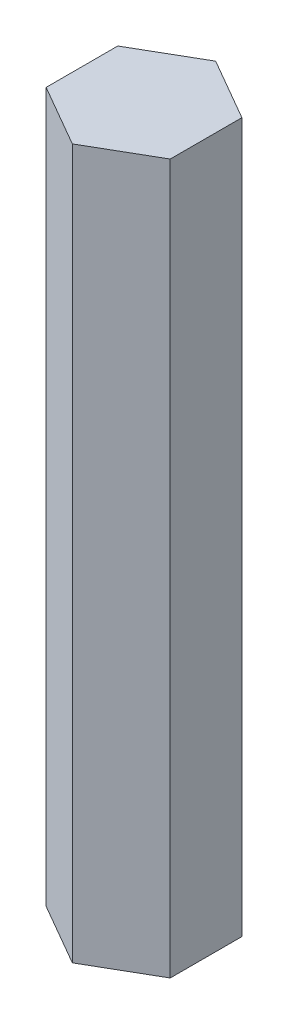
ISO-10303-21;
HEADER;
FILE_DESCRIPTION(('STEP AP214'),'2;1');
FILE_NAME('part.step','',(''),(''),'','','');
FILE_SCHEMA(('AUTOMOTIVE_DESIGN { 1 0 10303 214 1 1 1 1 }'));
ENDSEC;
DATA;
#1=APPLICATION_CONTEXT('core data for automotive mechanical design processes');
#2=APPLICATION_PROTOCOL_DEFINITION('international standard','automotive_design',2000,#1);
#3=PRODUCT_CONTEXT('',#1,'mechanical');
#4=PRODUCT('Part','Part','',(#3));
#5=PRODUCT_RELATED_PRODUCT_CATEGORY('part','',(#4));
#6=PRODUCT_DEFINITION_FORMATION('','',#4);
#7=PRODUCT_DEFINITION_CONTEXT('part definition',#1,'design');
#8=PRODUCT_DEFINITION('design','',#6,#7);
#9=PRODUCT_DEFINITION_SHAPE('','',#8);
#10=(LENGTH_UNIT() NAMED_UNIT(*) SI_UNIT(.MILLI.,.METRE.));
#11=(NAMED_UNIT(*) PLANE_ANGLE_UNIT() SI_UNIT($,.RADIAN.));
#12=(NAMED_UNIT(*) SI_UNIT($,.STERADIAN.) SOLID_ANGLE_UNIT());
#13=UNCERTAINTY_MEASURE_WITH_UNIT(LENGTH_MEASURE(1.E-05),#10,'distance_accuracy_value','');
#14=(GEOMETRIC_REPRESENTATION_CONTEXT(3) GLOBAL_UNCERTAINTY_ASSIGNED_CONTEXT((#13)) GLOBAL_UNIT_ASSIGNED_CONTEXT((#10,
#11,#12)) REPRESENTATION_CONTEXT('',''));
#15=CARTESIAN_POINT('',(0.,0.,0.));
#16=DIRECTION('',(0.,0.,1.));
#17=DIRECTION('',(1.,0.,0.));
#18=AXIS2_PLACEMENT_3D('',#15,#16,#17);
#19=CARTESIAN_POINT('',(3.5,40.,-2.02072594216369));
#20=DIRECTION('',(-0.5,0.,0.866025403784438));
#21=DIRECTION('',(0.866025403784439,0.,0.5));
#22=AXIS2_PLACEMENT_3D('',#19,#20,#21);
#23=PLANE('',#22);
#24=DIRECTION('',(-0.866025403784439,0.,-0.5));
#25=VECTOR('',#24,1.);
#26=CARTESIAN_POINT('',(3.5,0.,-2.02072594216369));
#27=LINE('',#26,#25);
#28=CARTESIAN_POINT('',(3.5,0.,-2.02072594216369));
#29=VERTEX_POINT('',#28);
#30=CARTESIAN_POINT('',(0.,0.,-4.04145188432738));
#31=VERTEX_POINT('',#30);
#32=EDGE_CURVE('E123',#29,#31,#27,.T.);
#33=ORIENTED_EDGE('',*,*,#32,.T.);
#34=DIRECTION('',(0.,-1.,0.));
#35=VECTOR('',#34,1.);
#36=CARTESIAN_POINT('',(0.,40.,-4.04145188432738));
#37=LINE('',#36,#35);
#38=CARTESIAN_POINT('',(0.,40.,-4.04145188432738));
#39=VERTEX_POINT('',#38);
#40=EDGE_CURVE('E11',#39,#31,#37,.T.);
#41=ORIENTED_EDGE('',*,*,#40,.F.);
#42=DIRECTION('',(-0.866025403784439,0.,-0.5));
#43=VECTOR('',#42,1.);
#44=CARTESIAN_POINT('',(3.5,40.,-2.02072594216369));
#45=LINE('',#44,#43);
#46=CARTESIAN_POINT('',(3.5,40.,-2.02072594216369));
#47=VERTEX_POINT('',#46);
#48=EDGE_CURVE('E133',#47,#39,#45,.T.);
#49=ORIENTED_EDGE('',*,*,#48,.F.);
#50=DIRECTION('',(0.,-1.,0.));
#51=VECTOR('',#50,1.);
#52=CARTESIAN_POINT('',(3.5,40.,-2.02072594216369));
#53=LINE('',#52,#51);
#54=EDGE_CURVE('E119',#47,#29,#53,.T.);
#55=ORIENTED_EDGE('',*,*,#54,.T.);
#56=EDGE_LOOP('',(#33,#41,#49,#55));
#57=FACE_BOUND('',#56,.T.);
#58=ADVANCED_FACE('F39',(#57),#23,.F.);
#59=CARTESIAN_POINT('',(0.,40.,-4.04145188432738));
#60=DIRECTION('',(0.5,0.,0.866025403784439));
#61=DIRECTION('',(0.866025403784439,0.,-0.5));
#62=AXIS2_PLACEMENT_3D('',#59,#60,#61);
#63=PLANE('',#62);
#64=DIRECTION('',(-0.866025403784439,0.,0.5));
#65=VECTOR('',#64,1.);
#66=CARTESIAN_POINT('',(0.,0.,-4.04145188432738));
#67=LINE('',#66,#65);
#68=CARTESIAN_POINT('',(-3.5,0.,-2.02072594216369));
#69=VERTEX_POINT('',#68);
#70=EDGE_CURVE('E126',#31,#69,#67,.T.);
#71=ORIENTED_EDGE('',*,*,#70,.T.);
#72=DIRECTION('',(0.,-1.,0.));
#73=VECTOR('',#72,1.);
#74=CARTESIAN_POINT('',(-3.5,40.,-2.02072594216369));
#75=LINE('',#74,#73);
#76=CARTESIAN_POINT('',(-3.5,40.,-2.02072594216369));
#77=VERTEX_POINT('',#76);
#78=EDGE_CURVE('E47',#77,#69,#75,.T.);
#79=ORIENTED_EDGE('',*,*,#78,.F.);
#80=DIRECTION('',(-0.866025403784439,0.,0.5));
#81=VECTOR('',#80,1.);
#82=CARTESIAN_POINT('',(0.,40.,-4.04145188432738));
#83=LINE('',#82,#81);
#84=EDGE_CURVE('E92',#39,#77,#83,.T.);
#85=ORIENTED_EDGE('',*,*,#84,.F.);
#86=ORIENTED_EDGE('',*,*,#40,.T.);
#87=EDGE_LOOP('',(#71,#79,#85,#86));
#88=FACE_BOUND('',#87,.T.);
#89=ADVANCED_FACE('F157',(#88),#63,.F.);
#90=CARTESIAN_POINT('',(-3.5,40.,-2.02072594216369));
#91=DIRECTION('',(1.,0.,0.));
#92=DIRECTION('',(0.,0.,-1.));
#93=AXIS2_PLACEMENT_3D('',#90,#91,#92);
#94=PLANE('',#93);
#95=DIRECTION('',(0.,0.,1.));
#96=VECTOR('',#95,1.);
#97=CARTESIAN_POINT('',(-3.5,0.,-2.02072594216369));
#98=LINE('',#97,#96);
#99=CARTESIAN_POINT('',(-3.50000000000001,0.,2.02072594216369));
#100=VERTEX_POINT('',#99);
#101=EDGE_CURVE('E128',#69,#100,#98,.T.);
#102=ORIENTED_EDGE('',*,*,#101,.T.);
#103=DIRECTION('',(0.,-1.,0.));
#104=VECTOR('',#103,1.);
#105=CARTESIAN_POINT('',(-3.50000000000001,40.,2.02072594216369));
#106=LINE('',#105,#104);
#107=CARTESIAN_POINT('',(-3.50000000000001,40.,2.02072594216369));
#108=VERTEX_POINT('',#107);
#109=EDGE_CURVE('E114',#108,#100,#106,.T.);
#110=ORIENTED_EDGE('',*,*,#109,.F.);
#111=DIRECTION('',(0.,0.,1.));
#112=VECTOR('',#111,1.);
#113=CARTESIAN_POINT('',(-3.5,40.,-2.02072594216369));
#114=LINE('',#113,#112);
#115=EDGE_CURVE('E105',#77,#108,#114,.T.);
#116=ORIENTED_EDGE('',*,*,#115,.F.);
#117=ORIENTED_EDGE('',*,*,#78,.T.);
#118=EDGE_LOOP('',(#102,#110,#116,#117));
#119=FACE_BOUND('',#118,.T.);
#120=ADVANCED_FACE('F139',(#119),#94,.F.);
#121=CARTESIAN_POINT('',(-3.50000000000001,40.,2.02072594216369));
#122=DIRECTION('',(0.500000000000001,0.,-0.866025403784438));
#123=DIRECTION('',(-0.866025403784438,0.,-0.500000000000001));
#124=AXIS2_PLACEMENT_3D('',#121,#122,#123);
#125=PLANE('',#124);
#126=DIRECTION('',(0.866025403784438,0.,0.500000000000001));
#127=VECTOR('',#126,1.);
#128=CARTESIAN_POINT('',(-3.50000000000001,0.,2.02072594216369));
#129=LINE('',#128,#127);
#130=CARTESIAN_POINT('',(0.,0.,4.04145188432738));
#131=VERTEX_POINT('',#130);
#132=EDGE_CURVE('E113',#100,#131,#129,.T.);
#133=ORIENTED_EDGE('',*,*,#132,.T.);
#134=DIRECTION('',(0.,-1.,0.));
#135=VECTOR('',#134,1.);
#136=CARTESIAN_POINT('',(0.,40.,4.04145188432738));
#137=LINE('',#136,#135);
#138=CARTESIAN_POINT('',(0.,40.,4.04145188432738));
#139=VERTEX_POINT('',#138);
#140=EDGE_CURVE('E110',#139,#131,#137,.T.);
#141=ORIENTED_EDGE('',*,*,#140,.F.);
#142=DIRECTION('',(0.866025403784438,0.,0.500000000000001));
#143=VECTOR('',#142,1.);
#144=CARTESIAN_POINT('',(-3.50000000000001,40.,2.02072594216369));
#145=LINE('',#144,#143);
#146=EDGE_CURVE('E99',#108,#139,#145,.T.);
#147=ORIENTED_EDGE('',*,*,#146,.F.);
#148=ORIENTED_EDGE('',*,*,#109,.T.);
#149=EDGE_LOOP('',(#133,#141,#147,#148));
#150=FACE_BOUND('',#149,.T.);
#151=ADVANCED_FACE('F111',(#150),#125,.F.);
#152=CARTESIAN_POINT('',(0.,40.,4.04145188432738));
#153=DIRECTION('',(-0.5,0.,-0.866025403784439));
#154=DIRECTION('',(-0.866025403784439,0.,0.5));
#155=AXIS2_PLACEMENT_3D('',#152,#153,#154);
#156=PLANE('',#155);
#157=DIRECTION('',(0.866025403784438,0.,-0.5));
#158=VECTOR('',#157,1.);
#159=CARTESIAN_POINT('',(0.,0.,4.04145188432738));
#160=LINE('',#159,#158);
#161=CARTESIAN_POINT('',(3.5,0.,2.02072594216369));
#162=VERTEX_POINT('',#161);
#163=EDGE_CURVE('E78',#131,#162,#160,.T.);
#164=ORIENTED_EDGE('',*,*,#163,.T.);
#165=DIRECTION('',(0.,-1.,0.));
#166=VECTOR('',#165,1.);
#167=CARTESIAN_POINT('',(3.5,40.,2.02072594216369));
#168=LINE('',#167,#166);
#169=CARTESIAN_POINT('',(3.5,40.,2.02072594216369));
#170=VERTEX_POINT('',#169);
#171=EDGE_CURVE('E115',#170,#162,#168,.T.);
#172=ORIENTED_EDGE('',*,*,#171,.F.);
#173=DIRECTION('',(0.866025403784438,0.,-0.5));
#174=VECTOR('',#173,1.);
#175=CARTESIAN_POINT('',(0.,40.,4.04145188432738));
#176=LINE('',#175,#174);
#177=EDGE_CURVE('E103',#139,#170,#176,.T.);
#178=ORIENTED_EDGE('',*,*,#177,.F.);
#179=ORIENTED_EDGE('',*,*,#140,.T.);
#180=EDGE_LOOP('',(#164,#172,#178,#179));
#181=FACE_BOUND('',#180,.T.);
#182=ADVANCED_FACE('F117',(#181),#156,.F.);
#183=CARTESIAN_POINT('',(3.5,40.,2.02072594216369));
#184=DIRECTION('',(-1.,0.,0.));
#185=DIRECTION('',(0.,0.,1.));
#186=AXIS2_PLACEMENT_3D('',#183,#184,#185);
#187=PLANE('',#186);
#188=DIRECTION('',(0.,0.,-1.));
#189=VECTOR('',#188,1.);
#190=CARTESIAN_POINT('',(3.5,0.,2.02072594216369));
#191=LINE('',#190,#189);
#192=EDGE_CURVE('E84',#162,#29,#191,.T.);
#193=ORIENTED_EDGE('',*,*,#192,.T.);
#194=ORIENTED_EDGE('',*,*,#54,.F.);
#195=DIRECTION('',(0.,0.,-1.));
#196=VECTOR('',#195,1.);
#197=CARTESIAN_POINT('',(3.5,40.,2.02072594216369));
#198=LINE('',#197,#196);
#199=EDGE_CURVE('E55',#170,#47,#198,.T.);
#200=ORIENTED_EDGE('',*,*,#199,.F.);
#201=ORIENTED_EDGE('',*,*,#171,.T.);
#202=EDGE_LOOP('',(#193,#194,#200,#201));
#203=FACE_BOUND('',#202,.T.);
#204=ADVANCED_FACE('F146',(#203),#187,.F.);
#205=CARTESIAN_POINT('',(0.,40.,0.));
#206=DIRECTION('',(0.,1.,0.));
#207=DIRECTION('',(0.,0.,1.));
#208=AXIS2_PLACEMENT_3D('',#205,#206,#207);
#209=PLANE('',#208);
#210=ORIENTED_EDGE('',*,*,#48,.T.);
#211=ORIENTED_EDGE('',*,*,#84,.T.);
#212=ORIENTED_EDGE('',*,*,#115,.T.);
#213=ORIENTED_EDGE('',*,*,#146,.T.);
#214=ORIENTED_EDGE('',*,*,#177,.T.);
#215=ORIENTED_EDGE('',*,*,#199,.T.);
#216=EDGE_LOOP('',(#210,#211,#212,#213,#214,#215));
#217=FACE_BOUND('',#216,.T.);
#218=ADVANCED_FACE('F101',(#217),#209,.T.);
#219=CARTESIAN_POINT('',(0.,0.,0.));
#220=DIRECTION('',(0.,1.,0.));
#221=DIRECTION('',(0.,0.,1.));
#222=AXIS2_PLACEMENT_3D('',#219,#220,#221);
#223=PLANE('',#222);
#224=ORIENTED_EDGE('',*,*,#32,.F.);
#225=ORIENTED_EDGE('',*,*,#192,.F.);
#226=ORIENTED_EDGE('',*,*,#163,.F.);
#227=ORIENTED_EDGE('',*,*,#132,.F.);
#228=ORIENTED_EDGE('',*,*,#101,.F.);
#229=ORIENTED_EDGE('',*,*,#70,.F.);
#230=EDGE_LOOP('',(#224,#225,#226,#227,#228,#229));
#231=FACE_BOUND('',#230,.T.);
#232=ADVANCED_FACE('F142',(#231),#223,.F.);
#233=CLOSED_SHELL('',(#58,#89,#120,#151,#182,#204,#218,#232));
#234=MANIFOLD_SOLID_BREP('B2',#233);
#235=ADVANCED_BREP_SHAPE_REPRESENTATION('',(#18,#234),#14);
#236=SHAPE_DEFINITION_REPRESENTATION(#9,#235);
ENDSEC;
END-ISO-10303-21;
